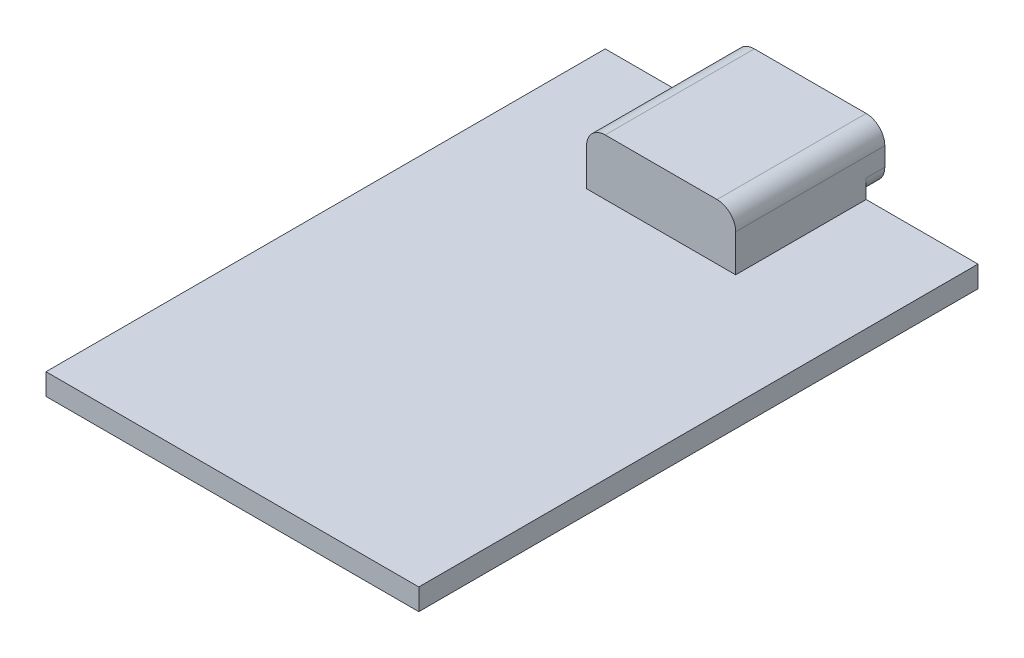
ISO-10303-21;
HEADER;
FILE_DESCRIPTION(('STEP AP214'),'2;1');
FILE_NAME('part.step','',(''),(''),'','','');
FILE_SCHEMA(('AUTOMOTIVE_DESIGN { 1 0 10303 214 1 1 1 1 }'));
ENDSEC;
DATA;
#1=APPLICATION_CONTEXT('core data for automotive mechanical design processes');
#2=APPLICATION_PROTOCOL_DEFINITION('international standard','automotive_design',2000,#1);
#3=PRODUCT_CONTEXT('',#1,'mechanical');
#4=PRODUCT('Part','Part','',(#3));
#5=PRODUCT_RELATED_PRODUCT_CATEGORY('part','',(#4));
#6=PRODUCT_DEFINITION_FORMATION('','',#4);
#7=PRODUCT_DEFINITION_CONTEXT('part definition',#1,'design');
#8=PRODUCT_DEFINITION('design','',#6,#7);
#9=PRODUCT_DEFINITION_SHAPE('','',#8);
#10=(LENGTH_UNIT() NAMED_UNIT(*) SI_UNIT(.MILLI.,.METRE.));
#11=(NAMED_UNIT(*) PLANE_ANGLE_UNIT() SI_UNIT($,.RADIAN.));
#12=(NAMED_UNIT(*) SI_UNIT($,.STERADIAN.) SOLID_ANGLE_UNIT());
#13=UNCERTAINTY_MEASURE_WITH_UNIT(LENGTH_MEASURE(1.E-05),#10,'distance_accuracy_value','');
#14=(GEOMETRIC_REPRESENTATION_CONTEXT(3) GLOBAL_UNCERTAINTY_ASSIGNED_CONTEXT((#13)) GLOBAL_UNIT_ASSIGNED_CONTEXT((#10,
#11,#12)) REPRESENTATION_CONTEXT('',''));
#15=CARTESIAN_POINT('',(0.,0.,0.));
#16=DIRECTION('',(0.,0.,1.));
#17=DIRECTION('',(1.,0.,0.));
#18=AXIS2_PLACEMENT_3D('',#15,#16,#17);
#19=CARTESIAN_POINT('',(10.,1.15,-15.));
#20=DIRECTION('',(-1.,0.,0.));
#21=DIRECTION('',(0.,0.,1.));
#22=AXIS2_PLACEMENT_3D('',#19,#20,#21);
#23=PLANE('',#22);
#24=DIRECTION('',(0.,0.,-1.));
#25=VECTOR('',#24,1.);
#26=CARTESIAN_POINT('',(10.,0.,-15.));
#27=LINE('',#26,#25);
#28=CARTESIAN_POINT('',(10.,0.,15.));
#29=VERTEX_POINT('',#28);
#30=CARTESIAN_POINT('',(10.,0.,-15.));
#31=VERTEX_POINT('',#30);
#32=EDGE_CURVE('E196',#29,#31,#27,.T.);
#33=ORIENTED_EDGE('',*,*,#32,.T.);
#34=DIRECTION('',(0.,-1.,0.));
#35=VECTOR('',#34,1.);
#36=CARTESIAN_POINT('',(10.,1.15,-15.));
#37=LINE('',#36,#35);
#38=CARTESIAN_POINT('',(10.,1.15,-15.));
#39=VERTEX_POINT('',#38);
#40=EDGE_CURVE('E237',#39,#31,#37,.T.);
#41=ORIENTED_EDGE('',*,*,#40,.F.);
#42=DIRECTION('',(0.,0.,-1.));
#43=VECTOR('',#42,1.);
#44=CARTESIAN_POINT('',(10.,1.15,-15.));
#45=LINE('',#44,#43);
#46=CARTESIAN_POINT('',(10.,1.15,15.));
#47=VERTEX_POINT('',#46);
#48=EDGE_CURVE('E200',#47,#39,#45,.T.);
#49=ORIENTED_EDGE('',*,*,#48,.F.);
#50=DIRECTION('',(0.,-1.,0.));
#51=VECTOR('',#50,1.);
#52=CARTESIAN_POINT('',(10.,1.15,15.));
#53=LINE('',#52,#51);
#54=EDGE_CURVE('E213',#47,#29,#53,.T.);
#55=ORIENTED_EDGE('',*,*,#54,.T.);
#56=EDGE_LOOP('',(#33,#41,#49,#55));
#57=FACE_BOUND('',#56,.T.);
#58=ADVANCED_FACE('F51',(#57),#23,.F.);
#59=CARTESIAN_POINT('',(-10.,1.15,-15.));
#60=DIRECTION('',(0.,0.,1.));
#61=DIRECTION('',(1.,0.,0.));
#62=AXIS2_PLACEMENT_3D('',#59,#60,#61);
#63=PLANE('',#62);
#64=DIRECTION('',(-1.,0.,0.));
#65=VECTOR('',#64,1.);
#66=CARTESIAN_POINT('',(-10.,0.,-15.));
#67=LINE('',#66,#65);
#68=CARTESIAN_POINT('',(-10.,0.,-15.));
#69=VERTEX_POINT('',#68);
#70=EDGE_CURVE('E220',#31,#69,#67,.T.);
#71=ORIENTED_EDGE('',*,*,#70,.T.);
#72=DIRECTION('',(0.,-1.,0.));
#73=VECTOR('',#72,1.);
#74=CARTESIAN_POINT('',(-10.,1.15,-15.));
#75=LINE('',#74,#73);
#76=CARTESIAN_POINT('',(-10.,1.15,-15.));
#77=VERTEX_POINT('',#76);
#78=EDGE_CURVE('E232',#77,#69,#75,.T.);
#79=ORIENTED_EDGE('',*,*,#78,.F.);
#80=DIRECTION('',(-1.,0.,0.));
#81=VECTOR('',#80,1.);
#82=CARTESIAN_POINT('',(-10.,1.15,-15.));
#83=LINE('',#82,#81);
#84=CARTESIAN_POINT('',(-4.,1.15,-15.));
#85=VERTEX_POINT('',#84);
#86=EDGE_CURVE('E205',#85,#77,#83,.T.);
#87=ORIENTED_EDGE('',*,*,#86,.F.);
#88=DIRECTION('',(0.,-1.,0.));
#89=VECTOR('',#88,1.);
#90=CARTESIAN_POINT('',(-4.,4.15,-15.));
#91=LINE('',#90,#89);
#92=CARTESIAN_POINT('',(-4.,2.15,-15.));
#93=VERTEX_POINT('',#92);
#94=EDGE_CURVE('E267',#93,#85,#91,.T.);
#95=ORIENTED_EDGE('',*,*,#94,.F.);
#96=CARTESIAN_POINT('',(-3.,2.15,-15.));
#97=DIRECTION('',(0.,0.,1.));
#98=DIRECTION('',(1.,0.,0.));
#99=AXIS2_PLACEMENT_3D('',#96,#97,#98);
#100=CIRCLE('',#99,1.);
#101=CARTESIAN_POINT('',(-3.,1.15,-15.));
#102=VERTEX_POINT('',#101);
#103=EDGE_CURVE('E11',#93,#102,#100,.T.);
#104=ORIENTED_EDGE('',*,*,#103,.T.);
#105=CARTESIAN_POINT('',(3.,1.15,-15.));
#106=VERTEX_POINT('',#105);
#107=EDGE_CURVE('E210',#106,#102,#83,.T.);
#108=ORIENTED_EDGE('',*,*,#107,.F.);
#109=CARTESIAN_POINT('',(3.,2.15,-15.));
#110=DIRECTION('',(0.,0.,1.));
#111=DIRECTION('',(1.,0.,0.));
#112=AXIS2_PLACEMENT_3D('',#109,#110,#111);
#113=CIRCLE('',#112,1.);
#114=CARTESIAN_POINT('',(4.,2.15,-15.));
#115=VERTEX_POINT('',#114);
#116=EDGE_CURVE('E58',#106,#115,#113,.T.);
#117=ORIENTED_EDGE('',*,*,#116,.T.);
#118=DIRECTION('',(0.,1.,0.));
#119=VECTOR('',#118,1.);
#120=CARTESIAN_POINT('',(4.,4.15,-15.));
#121=LINE('',#120,#119);
#122=CARTESIAN_POINT('',(4.,1.15,-15.));
#123=VERTEX_POINT('',#122);
#124=EDGE_CURVE('E67',#123,#115,#121,.T.);
#125=ORIENTED_EDGE('',*,*,#124,.F.);
#126=EDGE_CURVE('E175',#39,#123,#83,.T.);
#127=ORIENTED_EDGE('',*,*,#126,.F.);
#128=ORIENTED_EDGE('',*,*,#40,.T.);
#129=EDGE_LOOP('',(#71,#79,#87,#95,#104,#108,#117,#125,#127,#128));
#130=FACE_BOUND('',#129,.T.);
#131=ADVANCED_FACE('F292',(#130),#63,.F.);
#132=CARTESIAN_POINT('',(-10.,1.15,-15.));
#133=DIRECTION('',(1.,0.,0.));
#134=DIRECTION('',(0.,0.,-1.));
#135=AXIS2_PLACEMENT_3D('',#132,#133,#134);
#136=PLANE('',#135);
#137=DIRECTION('',(0.,0.,1.));
#138=VECTOR('',#137,1.);
#139=CARTESIAN_POINT('',(-10.,0.,-15.));
#140=LINE('',#139,#138);
#141=CARTESIAN_POINT('',(-10.,0.,15.));
#142=VERTEX_POINT('',#141);
#143=EDGE_CURVE('E219',#69,#142,#140,.T.);
#144=ORIENTED_EDGE('',*,*,#143,.T.);
#145=DIRECTION('',(0.,-1.,0.));
#146=VECTOR('',#145,1.);
#147=CARTESIAN_POINT('',(-10.,1.15,15.));
#148=LINE('',#147,#146);
#149=CARTESIAN_POINT('',(-10.,1.15,15.));
#150=VERTEX_POINT('',#149);
#151=EDGE_CURVE('E227',#150,#142,#148,.T.);
#152=ORIENTED_EDGE('',*,*,#151,.F.);
#153=DIRECTION('',(0.,0.,1.));
#154=VECTOR('',#153,1.);
#155=CARTESIAN_POINT('',(-10.,1.15,-15.));
#156=LINE('',#155,#154);
#157=EDGE_CURVE('E206',#77,#150,#156,.T.);
#158=ORIENTED_EDGE('',*,*,#157,.F.);
#159=ORIENTED_EDGE('',*,*,#78,.T.);
#160=EDGE_LOOP('',(#144,#152,#158,#159));
#161=FACE_BOUND('',#160,.T.);
#162=ADVANCED_FACE('F340',(#161),#136,.F.);
#163=CARTESIAN_POINT('',(-10.,1.15,15.));
#164=DIRECTION('',(0.,0.,-1.));
#165=DIRECTION('',(-1.,0.,0.));
#166=AXIS2_PLACEMENT_3D('',#163,#164,#165);
#167=PLANE('',#166);
#168=DIRECTION('',(1.,0.,0.));
#169=VECTOR('',#168,1.);
#170=CARTESIAN_POINT('',(-10.,0.,15.));
#171=LINE('',#170,#169);
#172=EDGE_CURVE('E201',#142,#29,#171,.T.);
#173=ORIENTED_EDGE('',*,*,#172,.T.);
#174=ORIENTED_EDGE('',*,*,#54,.F.);
#175=DIRECTION('',(1.,0.,0.));
#176=VECTOR('',#175,1.);
#177=CARTESIAN_POINT('',(-10.,1.15,15.));
#178=LINE('',#177,#176);
#179=EDGE_CURVE('E209',#150,#47,#178,.T.);
#180=ORIENTED_EDGE('',*,*,#179,.F.);
#181=ORIENTED_EDGE('',*,*,#151,.T.);
#182=EDGE_LOOP('',(#173,#174,#180,#181));
#183=FACE_BOUND('',#182,.T.);
#184=ADVANCED_FACE('F362',(#183),#167,.F.);
#185=CARTESIAN_POINT('',(0.,1.15,0.));
#186=DIRECTION('',(0.,1.,0.));
#187=DIRECTION('',(0.,0.,1.));
#188=AXIS2_PLACEMENT_3D('',#185,#186,#187);
#189=PLANE('',#188);
#190=DIRECTION('',(0.,0.,1.));
#191=VECTOR('',#190,1.);
#192=CARTESIAN_POINT('',(-4.,1.15,-8.));
#193=LINE('',#192,#191);
#194=CARTESIAN_POINT('',(-4.,1.15,-8.));
#195=VERTEX_POINT('',#194);
#196=EDGE_CURVE('E182',#85,#195,#193,.T.);
#197=ORIENTED_EDGE('',*,*,#196,.F.);
#198=ORIENTED_EDGE('',*,*,#86,.T.);
#199=ORIENTED_EDGE('',*,*,#157,.T.);
#200=ORIENTED_EDGE('',*,*,#179,.T.);
#201=ORIENTED_EDGE('',*,*,#48,.T.);
#202=ORIENTED_EDGE('',*,*,#126,.T.);
#203=DIRECTION('',(0.,0.,-1.));
#204=VECTOR('',#203,1.);
#205=CARTESIAN_POINT('',(4.,1.15,-8.));
#206=LINE('',#205,#204);
#207=CARTESIAN_POINT('',(4.,1.15,-8.));
#208=VERTEX_POINT('',#207);
#209=EDGE_CURVE('E154',#208,#123,#206,.T.);
#210=ORIENTED_EDGE('',*,*,#209,.F.);
#211=DIRECTION('',(1.,0.,0.));
#212=VECTOR('',#211,1.);
#213=CARTESIAN_POINT('',(4.,1.15,-8.));
#214=LINE('',#213,#212);
#215=EDGE_CURVE('E166',#195,#208,#214,.T.);
#216=ORIENTED_EDGE('',*,*,#215,.F.);
#217=EDGE_LOOP('',(#197,#198,#199,#200,#201,#202,#210,#216));
#218=FACE_BOUND('',#217,.T.);
#219=ADVANCED_FACE('F169',(#218),#189,.T.);
#220=CARTESIAN_POINT('',(0.,0.,0.));
#221=DIRECTION('',(0.,1.,0.));
#222=DIRECTION('',(0.,0.,1.));
#223=AXIS2_PLACEMENT_3D('',#220,#221,#222);
#224=PLANE('',#223);
#225=ORIENTED_EDGE('',*,*,#32,.F.);
#226=ORIENTED_EDGE('',*,*,#172,.F.);
#227=ORIENTED_EDGE('',*,*,#143,.F.);
#228=ORIENTED_EDGE('',*,*,#70,.F.);
#229=EDGE_LOOP('',(#225,#226,#227,#228));
#230=FACE_BOUND('',#229,.T.);
#231=ADVANCED_FACE('F355',(#230),#224,.F.);
#232=CARTESIAN_POINT('',(0.,1.15,0.));
#233=DIRECTION('',(0.,1.,0.));
#234=DIRECTION('',(0.,0.,1.));
#235=AXIS2_PLACEMENT_3D('',#232,#233,#234);
#236=PLANE('',#235);
#237=DIRECTION('',(-1.,0.,0.));
#238=VECTOR('',#237,1.);
#239=CARTESIAN_POINT('',(4.,1.15,-16.));
#240=LINE('',#239,#238);
#241=CARTESIAN_POINT('',(3.,1.15,-16.));
#242=VERTEX_POINT('',#241);
#243=CARTESIAN_POINT('',(-3.,1.15,-16.));
#244=VERTEX_POINT('',#243);
#245=EDGE_CURVE('E173',#242,#244,#240,.T.);
#246=ORIENTED_EDGE('',*,*,#245,.F.);
#247=DIRECTION('',(0.,0.,-1.));
#248=VECTOR('',#247,1.);
#249=CARTESIAN_POINT('',(3.,1.15,0.));
#250=LINE('',#249,#248);
#251=EDGE_CURVE('E263',#242,#106,#250,.F.);
#252=ORIENTED_EDGE('',*,*,#251,.T.);
#253=ORIENTED_EDGE('',*,*,#107,.T.);
#254=DIRECTION('',(0.,0.,1.));
#255=VECTOR('',#254,1.);
#256=CARTESIAN_POINT('',(-3.,1.15,0.));
#257=LINE('',#256,#255);
#258=EDGE_CURVE('E257',#102,#244,#257,.F.);
#259=ORIENTED_EDGE('',*,*,#258,.T.);
#260=EDGE_LOOP('',(#246,#252,#253,#259));
#261=FACE_BOUND('',#260,.T.);
#262=ADVANCED_FACE('F302',(#261),#236,.F.);
#263=CARTESIAN_POINT('',(-4.,4.15,-8.));
#264=DIRECTION('',(1.,0.,0.));
#265=DIRECTION('',(0.,0.,-1.));
#266=AXIS2_PLACEMENT_3D('',#263,#264,#265);
#267=PLANE('',#266);
#268=DIRECTION('',(0.,-1.,0.));
#269=VECTOR('',#268,1.);
#270=CARTESIAN_POINT('',(-4.,4.15,-16.));
#271=LINE('',#270,#269);
#272=CARTESIAN_POINT('',(-4.,3.15,-16.));
#273=VERTEX_POINT('',#272);
#274=CARTESIAN_POINT('',(-4.,2.15,-16.));
#275=VERTEX_POINT('',#274);
#276=EDGE_CURVE('E187',#273,#275,#271,.T.);
#277=ORIENTED_EDGE('',*,*,#276,.T.);
#278=DIRECTION('',(0.,0.,1.));
#279=VECTOR('',#278,1.);
#280=CARTESIAN_POINT('',(-4.,2.15,-8.));
#281=LINE('',#280,#279);
#282=EDGE_CURVE('E275',#275,#93,#281,.T.);
#283=ORIENTED_EDGE('',*,*,#282,.T.);
#284=ORIENTED_EDGE('',*,*,#94,.T.);
#285=ORIENTED_EDGE('',*,*,#196,.T.);
#286=DIRECTION('',(0.,-1.,0.));
#287=VECTOR('',#286,1.);
#288=CARTESIAN_POINT('',(-4.,4.15,-8.));
#289=LINE('',#288,#287);
#290=CARTESIAN_POINT('',(-4.,3.15,-8.));
#291=VERTEX_POINT('',#290);
#292=EDGE_CURVE('E165',#291,#195,#289,.T.);
#293=ORIENTED_EDGE('',*,*,#292,.F.);
#294=DIRECTION('',(0.,0.,1.));
#295=VECTOR('',#294,1.);
#296=CARTESIAN_POINT('',(-4.,3.15,-16.));
#297=LINE('',#296,#295);
#298=EDGE_CURVE('E266',#291,#273,#297,.F.);
#299=ORIENTED_EDGE('',*,*,#298,.T.);
#300=EDGE_LOOP('',(#277,#283,#284,#285,#293,#299));
#301=FACE_BOUND('',#300,.T.);
#302=ADVANCED_FACE('F313',(#301),#267,.F.);
#303=CARTESIAN_POINT('',(4.,4.15,-8.));
#304=DIRECTION('',(0.,0.,-1.));
#305=DIRECTION('',(-1.,0.,0.));
#306=AXIS2_PLACEMENT_3D('',#303,#304,#305);
#307=PLANE('',#306);
#308=DIRECTION('',(0.,-1.,0.));
#309=VECTOR('',#308,1.);
#310=CARTESIAN_POINT('',(4.,4.15,-8.));
#311=LINE('',#310,#309);
#312=CARTESIAN_POINT('',(4.,3.15,-8.));
#313=VERTEX_POINT('',#312);
#314=EDGE_CURVE('E155',#313,#208,#311,.T.);
#315=ORIENTED_EDGE('',*,*,#314,.F.);
#316=CARTESIAN_POINT('',(3.,3.15,-8.));
#317=DIRECTION('',(0.,0.,-1.));
#318=DIRECTION('',(-1.,0.,0.));
#319=AXIS2_PLACEMENT_3D('',#316,#317,#318);
#320=CIRCLE('',#319,1.);
#321=CARTESIAN_POINT('',(3.,4.15,-8.));
#322=VERTEX_POINT('',#321);
#323=EDGE_CURVE('E73',#313,#322,#320,.F.);
#324=ORIENTED_EDGE('',*,*,#323,.T.);
#325=DIRECTION('',(1.,0.,0.));
#326=VECTOR('',#325,1.);
#327=CARTESIAN_POINT('',(4.,4.15,-8.));
#328=LINE('',#327,#326);
#329=CARTESIAN_POINT('',(-3.,4.15,-8.));
#330=VERTEX_POINT('',#329);
#331=EDGE_CURVE('E190',#330,#322,#328,.T.);
#332=ORIENTED_EDGE('',*,*,#331,.F.);
#333=CARTESIAN_POINT('',(-3.,3.15,-8.));
#334=DIRECTION('',(0.,0.,-1.));
#335=DIRECTION('',(-1.,0.,0.));
#336=AXIS2_PLACEMENT_3D('',#333,#334,#335);
#337=CIRCLE('',#336,1.);
#338=EDGE_CURVE('E283',#330,#291,#337,.F.);
#339=ORIENTED_EDGE('',*,*,#338,.T.);
#340=ORIENTED_EDGE('',*,*,#292,.T.);
#341=ORIENTED_EDGE('',*,*,#215,.T.);
#342=EDGE_LOOP('',(#315,#324,#332,#339,#340,#341));
#343=FACE_BOUND('',#342,.T.);
#344=ADVANCED_FACE('F176',(#343),#307,.F.);
#345=CARTESIAN_POINT('',(4.,4.15,-8.));
#346=DIRECTION('',(-1.,0.,0.));
#347=DIRECTION('',(0.,0.,1.));
#348=AXIS2_PLACEMENT_3D('',#345,#346,#347);
#349=PLANE('',#348);
#350=ORIENTED_EDGE('',*,*,#124,.T.);
#351=DIRECTION('',(0.,0.,-1.));
#352=VECTOR('',#351,1.);
#353=CARTESIAN_POINT('',(4.,2.15,-8.));
#354=LINE('',#353,#352);
#355=CARTESIAN_POINT('',(4.,2.15,-16.));
#356=VERTEX_POINT('',#355);
#357=EDGE_CURVE('E243',#115,#356,#354,.T.);
#358=ORIENTED_EDGE('',*,*,#357,.T.);
#359=DIRECTION('',(0.,-1.,0.));
#360=VECTOR('',#359,1.);
#361=CARTESIAN_POINT('',(4.,4.15,-16.));
#362=LINE('',#361,#360);
#363=CARTESIAN_POINT('',(4.,3.15,-16.));
#364=VERTEX_POINT('',#363);
#365=EDGE_CURVE('E162',#364,#356,#362,.T.);
#366=ORIENTED_EDGE('',*,*,#365,.F.);
#367=DIRECTION('',(0.,0.,-1.));
#368=VECTOR('',#367,1.);
#369=CARTESIAN_POINT('',(4.,3.15,-8.));
#370=LINE('',#369,#368);
#371=EDGE_CURVE('E157',#364,#313,#370,.F.);
#372=ORIENTED_EDGE('',*,*,#371,.T.);
#373=ORIENTED_EDGE('',*,*,#314,.T.);
#374=ORIENTED_EDGE('',*,*,#209,.T.);
#375=EDGE_LOOP('',(#350,#358,#366,#372,#373,#374));
#376=FACE_BOUND('',#375,.T.);
#377=ADVANCED_FACE('F152',(#376),#349,.F.);
#378=CARTESIAN_POINT('',(4.,4.15,-16.));
#379=DIRECTION('',(0.,0.,1.));
#380=DIRECTION('',(1.,0.,0.));
#381=AXIS2_PLACEMENT_3D('',#378,#379,#380);
#382=PLANE('',#381);
#383=ORIENTED_EDGE('',*,*,#365,.T.);
#384=CARTESIAN_POINT('',(3.,2.15,-16.));
#385=DIRECTION('',(0.,0.,1.));
#386=DIRECTION('',(1.,0.,0.));
#387=AXIS2_PLACEMENT_3D('',#384,#385,#386);
#388=CIRCLE('',#387,1.);
#389=EDGE_CURVE('E260',#356,#242,#388,.F.);
#390=ORIENTED_EDGE('',*,*,#389,.T.);
#391=ORIENTED_EDGE('',*,*,#245,.T.);
#392=CARTESIAN_POINT('',(-3.,2.15,-16.));
#393=DIRECTION('',(0.,0.,1.));
#394=DIRECTION('',(1.,0.,0.));
#395=AXIS2_PLACEMENT_3D('',#392,#393,#394);
#396=CIRCLE('',#395,1.);
#397=EDGE_CURVE('E255',#244,#275,#396,.F.);
#398=ORIENTED_EDGE('',*,*,#397,.T.);
#399=ORIENTED_EDGE('',*,*,#276,.F.);
#400=CARTESIAN_POINT('',(-3.,3.15,-16.));
#401=DIRECTION('',(0.,0.,1.));
#402=DIRECTION('',(1.,0.,0.));
#403=AXIS2_PLACEMENT_3D('',#400,#401,#402);
#404=CIRCLE('',#403,1.);
#405=CARTESIAN_POINT('',(-3.,4.15,-16.));
#406=VERTEX_POINT('',#405);
#407=EDGE_CURVE('E249',#273,#406,#404,.F.);
#408=ORIENTED_EDGE('',*,*,#407,.T.);
#409=DIRECTION('',(-1.,0.,0.));
#410=VECTOR('',#409,1.);
#411=CARTESIAN_POINT('',(4.,4.15,-16.));
#412=LINE('',#411,#410);
#413=CARTESIAN_POINT('',(3.,4.15,-16.));
#414=VERTEX_POINT('',#413);
#415=EDGE_CURVE('E192',#414,#406,#412,.T.);
#416=ORIENTED_EDGE('',*,*,#415,.F.);
#417=CARTESIAN_POINT('',(3.,3.15,-16.));
#418=DIRECTION('',(0.,0.,1.));
#419=DIRECTION('',(1.,0.,0.));
#420=AXIS2_PLACEMENT_3D('',#417,#418,#419);
#421=CIRCLE('',#420,1.);
#422=EDGE_CURVE('E253',#414,#364,#421,.F.);
#423=ORIENTED_EDGE('',*,*,#422,.T.);
#424=EDGE_LOOP('',(#383,#390,#391,#398,#399,#408,#416,#423));
#425=FACE_BOUND('',#424,.T.);
#426=ADVANCED_FACE('F298',(#425),#382,.F.);
#427=CARTESIAN_POINT('',(0.,4.15,0.));
#428=DIRECTION('',(0.,1.,0.));
#429=DIRECTION('',(0.,0.,1.));
#430=AXIS2_PLACEMENT_3D('',#427,#428,#429);
#431=PLANE('',#430);
#432=ORIENTED_EDGE('',*,*,#331,.T.);
#433=DIRECTION('',(0.,0.,-1.));
#434=VECTOR('',#433,1.);
#435=CARTESIAN_POINT('',(3.,4.15,-16.));
#436=LINE('',#435,#434);
#437=EDGE_CURVE('E278',#322,#414,#436,.T.);
#438=ORIENTED_EDGE('',*,*,#437,.T.);
#439=ORIENTED_EDGE('',*,*,#415,.T.);
#440=DIRECTION('',(0.,0.,1.));
#441=VECTOR('',#440,1.);
#442=CARTESIAN_POINT('',(-3.,4.15,-8.));
#443=LINE('',#442,#441);
#444=EDGE_CURVE('E277',#406,#330,#443,.T.);
#445=ORIENTED_EDGE('',*,*,#444,.T.);
#446=EDGE_LOOP('',(#432,#438,#439,#445));
#447=FACE_BOUND('',#446,.T.);
#448=ADVANCED_FACE('F318',(#447),#431,.T.);
#449=CARTESIAN_POINT('',(3.,2.15,-8.));
#450=DIRECTION('',(0.,0.,-1.));
#451=DIRECTION('',(-1.,0.,0.));
#452=AXIS2_PLACEMENT_3D('',#449,#450,#451);
#453=CYLINDRICAL_SURFACE('',#452,1.);
#454=ORIENTED_EDGE('',*,*,#116,.F.);
#455=ORIENTED_EDGE('',*,*,#251,.F.);
#456=ORIENTED_EDGE('',*,*,#389,.F.);
#457=ORIENTED_EDGE('',*,*,#357,.F.);
#458=EDGE_LOOP('',(#454,#455,#456,#457));
#459=FACE_BOUND('',#458,.T.);
#460=ADVANCED_FACE('F296',(#459),#453,.T.);
#461=CARTESIAN_POINT('',(-3.,2.15,-8.));
#462=DIRECTION('',(0.,0.,1.));
#463=DIRECTION('',(1.,0.,0.));
#464=AXIS2_PLACEMENT_3D('',#461,#462,#463);
#465=CYLINDRICAL_SURFACE('',#464,1.);
#466=ORIENTED_EDGE('',*,*,#397,.F.);
#467=ORIENTED_EDGE('',*,*,#258,.F.);
#468=ORIENTED_EDGE('',*,*,#103,.F.);
#469=ORIENTED_EDGE('',*,*,#282,.F.);
#470=EDGE_LOOP('',(#466,#467,#468,#469));
#471=FACE_BOUND('',#470,.T.);
#472=ADVANCED_FACE('F305',(#471),#465,.T.);
#473=CARTESIAN_POINT('',(3.,3.15,0.));
#474=DIRECTION('',(0.,0.,1.));
#475=DIRECTION('',(1.,0.,0.));
#476=AXIS2_PLACEMENT_3D('',#473,#474,#475);
#477=CYLINDRICAL_SURFACE('',#476,1.);
#478=ORIENTED_EDGE('',*,*,#323,.F.);
#479=ORIENTED_EDGE('',*,*,#371,.F.);
#480=ORIENTED_EDGE('',*,*,#422,.F.);
#481=ORIENTED_EDGE('',*,*,#437,.F.);
#482=EDGE_LOOP('',(#478,#479,#480,#481));
#483=FACE_BOUND('',#482,.T.);
#484=ADVANCED_FACE('F322',(#483),#477,.T.);
#485=CARTESIAN_POINT('',(-3.,3.15,0.));
#486=DIRECTION('',(0.,0.,-1.));
#487=DIRECTION('',(-1.,0.,0.));
#488=AXIS2_PLACEMENT_3D('',#485,#486,#487);
#489=CYLINDRICAL_SURFACE('',#488,1.);
#490=ORIENTED_EDGE('',*,*,#407,.F.);
#491=ORIENTED_EDGE('',*,*,#298,.F.);
#492=ORIENTED_EDGE('',*,*,#338,.F.);
#493=ORIENTED_EDGE('',*,*,#444,.F.);
#494=EDGE_LOOP('',(#490,#491,#492,#493));
#495=FACE_BOUND('',#494,.T.);
#496=ADVANCED_FACE('F52',(#495),#489,.T.);
#497=CLOSED_SHELL('',(#58,#131,#162,#184,#219,#231,#262,#302,#344,#377,#426,#448,#460,#472,#484,#496));
#498=MANIFOLD_SOLID_BREP('B2',#497);
#499=ADVANCED_BREP_SHAPE_REPRESENTATION('',(#18,#498),#14);
#500=SHAPE_DEFINITION_REPRESENTATION(#9,#499);
ENDSEC;
END-ISO-10303-21;
